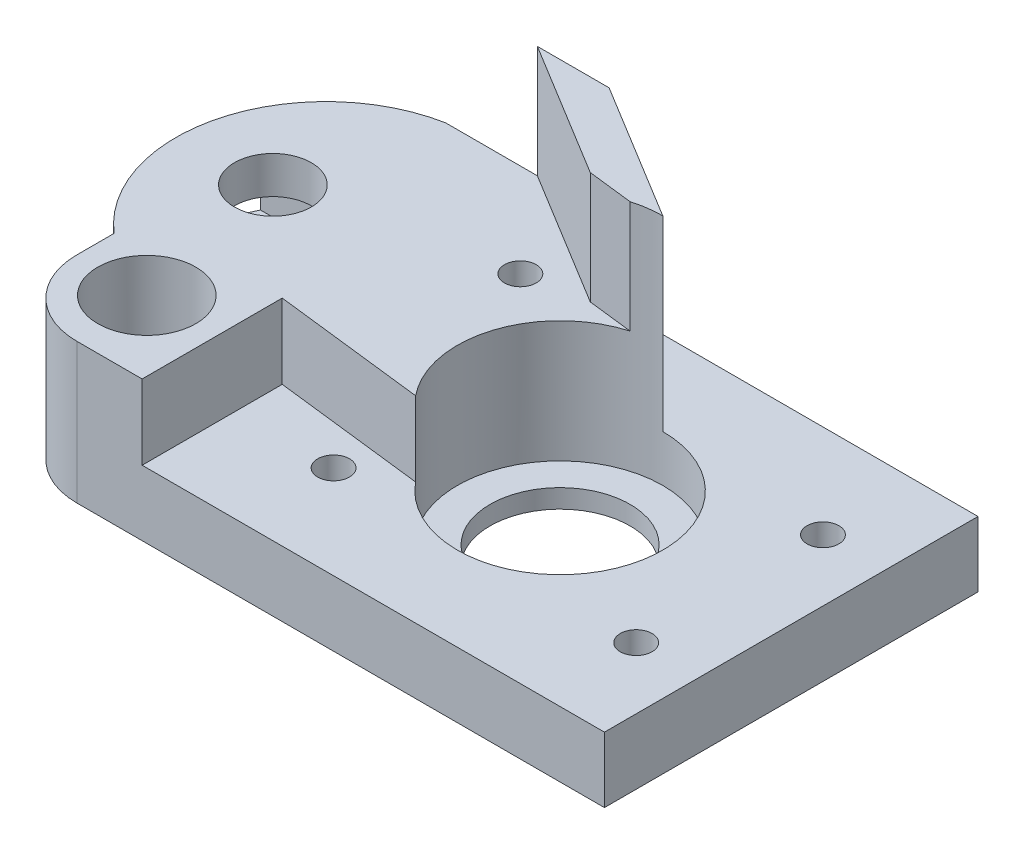
ISO-10303-21;
HEADER;
FILE_DESCRIPTION(('STEP AP214'),'2;1');
FILE_NAME('part.step','',(''),(''),'','','');
FILE_SCHEMA(('AUTOMOTIVE_DESIGN { 1 0 10303 214 1 1 1 1 }'));
ENDSEC;
DATA;
#1=APPLICATION_CONTEXT('core data for automotive mechanical design processes');
#2=APPLICATION_PROTOCOL_DEFINITION('international standard','automotive_design',2000,#1);
#3=PRODUCT_CONTEXT('',#1,'mechanical');
#4=PRODUCT('Part','Part','',(#3));
#5=PRODUCT_RELATED_PRODUCT_CATEGORY('part','',(#4));
#6=PRODUCT_DEFINITION_FORMATION('','',#4);
#7=PRODUCT_DEFINITION_CONTEXT('part definition',#1,'design');
#8=PRODUCT_DEFINITION('design','',#6,#7);
#9=PRODUCT_DEFINITION_SHAPE('','',#8);
#10=(LENGTH_UNIT() NAMED_UNIT(*) SI_UNIT(.MILLI.,.METRE.));
#11=(NAMED_UNIT(*) PLANE_ANGLE_UNIT() SI_UNIT($,.RADIAN.));
#12=(NAMED_UNIT(*) SI_UNIT($,.STERADIAN.) SOLID_ANGLE_UNIT());
#13=UNCERTAINTY_MEASURE_WITH_UNIT(LENGTH_MEASURE(1.E-05),#10,'distance_accuracy_value','');
#14=(GEOMETRIC_REPRESENTATION_CONTEXT(3) GLOBAL_UNCERTAINTY_ASSIGNED_CONTEXT((#13)) GLOBAL_UNIT_ASSIGNED_CONTEXT((#10,
#11,#12)) REPRESENTATION_CONTEXT('',''));
#15=CARTESIAN_POINT('',(0.,0.,0.));
#16=DIRECTION('',(0.,0.,1.));
#17=DIRECTION('',(1.,0.,0.));
#18=AXIS2_PLACEMENT_3D('',#15,#16,#17);
#19=CARTESIAN_POINT('',(-29.2478757622041,13.,-4.19139529344752));
#20=DIRECTION('',(0.,-1.,0.));
#21=DIRECTION('',(0.,0.,-1.));
#22=AXIS2_PLACEMENT_3D('',#19,#20,#21);
#23=CYLINDRICAL_SURFACE('',#22,16.0911383285089);
#24=CARTESIAN_POINT('',(-29.2478757622041,-2.,-4.19139529344752));
#25=DIRECTION('',(0.,-1.,0.));
#26=DIRECTION('',(0.,0.,-1.));
#27=AXIS2_PLACEMENT_3D('',#24,#25,#26);
#28=CIRCLE('',#27,16.0911383285089);
#29=CARTESIAN_POINT('',(-32.250000000002,-2.,-20.));
#30=VERTEX_POINT('',#29);
#31=CARTESIAN_POINT('',(-39.75,-2.,8.));
#32=VERTEX_POINT('',#31);
#33=EDGE_CURVE('E179',#30,#32,#28,.F.);
#34=ORIENTED_EDGE('',*,*,#33,.T.);
#35=DIRECTION('',(0.,-1.,0.));
#36=VECTOR('',#35,1.);
#37=CARTESIAN_POINT('',(-39.75,0.,8.));
#38=LINE('',#37,#36);
#39=CARTESIAN_POINT('',(-39.75,13.,8.));
#40=VERTEX_POINT('',#39);
#41=EDGE_CURVE('E294',#40,#32,#38,.T.);
#42=ORIENTED_EDGE('',*,*,#41,.F.);
#43=CARTESIAN_POINT('',(-29.2478757622041,13.,-4.19139529344752));
#44=DIRECTION('',(0.,-1.,0.));
#45=DIRECTION('',(0.,0.,-1.));
#46=AXIS2_PLACEMENT_3D('',#43,#44,#45);
#47=CIRCLE('',#46,16.0911383285089);
#48=CARTESIAN_POINT('',(-32.250000000002,13.,-20.));
#49=VERTEX_POINT('',#48);
#50=EDGE_CURVE('E203',#49,#40,#47,.F.);
#51=ORIENTED_EDGE('',*,*,#50,.F.);
#52=DIRECTION('',(0.,-1.,0.));
#53=VECTOR('',#52,1.);
#54=CARTESIAN_POINT('',(-32.250000000002,13.,-20.));
#55=LINE('',#54,#53);
#56=EDGE_CURVE('E207',#49,#30,#55,.T.);
#57=ORIENTED_EDGE('',*,*,#56,.T.);
#58=EDGE_LOOP('',(#34,#42,#51,#57));
#59=FACE_BOUND('',#58,.T.);
#60=CARTESIAN_POINT('',(-29.2478757622041,3.49999999999999,-4.19139529344752));
#61=DIRECTION('',(0.,1.,0.));
#62=DIRECTION('',(0.,0.,1.));
#63=AXIS2_PLACEMENT_3D('',#60,#61,#62);
#64=CIRCLE('',#63,16.0911383285089);
#65=CARTESIAN_POINT('',(-43.5834619012696,3.49999999999999,-11.5));
#66=VERTEX_POINT('',#65);
#67=CARTESIAN_POINT('',(-44.2988807891427,3.49999999999999,1.5));
#68=VERTEX_POINT('',#67);
#69=EDGE_CURVE('E165',#66,#68,#64,.T.);
#70=ORIENTED_EDGE('',*,*,#69,.F.);
#71=DIRECTION('',(0.,-1.,0.));
#72=VECTOR('',#71,1.);
#73=CARTESIAN_POINT('',(-43.5834619012696,13.,-11.5));
#74=LINE('',#73,#72);
#75=CARTESIAN_POINT('',(-43.5834619012696,8.99999999999999,-11.5));
#76=VERTEX_POINT('',#75);
#77=EDGE_CURVE('E687',#66,#76,#74,.F.);
#78=ORIENTED_EDGE('',*,*,#77,.T.);
#79=CARTESIAN_POINT('',(-29.2478757622041,8.99999999999999,-4.19139529344752));
#80=DIRECTION('',(0.,1.,0.));
#81=DIRECTION('',(0.,0.,1.));
#82=AXIS2_PLACEMENT_3D('',#79,#80,#81);
#83=CIRCLE('',#82,16.0911383285089);
#84=CARTESIAN_POINT('',(-44.2988807891427,8.99999999999999,1.5));
#85=VERTEX_POINT('',#84);
#86=EDGE_CURVE('E696',#76,#85,#83,.T.);
#87=ORIENTED_EDGE('',*,*,#86,.T.);
#88=DIRECTION('',(0.,-1.,0.));
#89=VECTOR('',#88,1.);
#90=CARTESIAN_POINT('',(-44.2988807891427,13.,1.5));
#91=LINE('',#90,#89);
#92=EDGE_CURVE('E692',#85,#68,#91,.T.);
#93=ORIENTED_EDGE('',*,*,#92,.T.);
#94=EDGE_LOOP('',(#70,#78,#87,#93));
#95=FACE_BOUND('',#94,.T.);
#96=ADVANCED_FACE('F34',(#59,#95),#23,.T.);
#97=CARTESIAN_POINT('',(0.,5.,0.));
#98=DIRECTION('',(0.,1.,0.));
#99=DIRECTION('',(0.,0.,1.));
#100=AXIS2_PLACEMENT_3D('',#97,#98,#99);
#101=PLANE('',#100);
#102=CARTESIAN_POINT('',(-14.25,5.,10.));
#103=DIRECTION('',(0.,1.,0.));
#104=DIRECTION('',(0.,0.,1.));
#105=AXIS2_PLACEMENT_3D('',#102,#103,#104);
#106=CIRCLE('',#105,1.7);
#107=CARTESIAN_POINT('',(-14.25,5.,11.7));
#108=VERTEX_POINT('',#107);
#109=EDGE_CURVE('E345',#108,#108,#106,.T.);
#110=ORIENTED_EDGE('',*,*,#109,.F.);
#111=EDGE_LOOP('',(#110));
#112=FACE_BOUND('',#111,.T.);
#113=CARTESIAN_POINT('',(18.15,5.,-10.));
#114=DIRECTION('',(0.,1.,0.));
#115=DIRECTION('',(0.,0.,1.));
#116=AXIS2_PLACEMENT_3D('',#113,#114,#115);
#117=CIRCLE('',#116,1.7);
#118=CARTESIAN_POINT('',(18.15,5.,-8.3));
#119=VERTEX_POINT('',#118);
#120=EDGE_CURVE('E338',#119,#119,#117,.T.);
#121=ORIENTED_EDGE('',*,*,#120,.F.);
#122=EDGE_LOOP('',(#121));
#123=FACE_BOUND('',#122,.T.);
#124=CARTESIAN_POINT('',(18.15,5.,10.));
#125=DIRECTION('',(0.,1.,0.));
#126=DIRECTION('',(0.,0.,1.));
#127=AXIS2_PLACEMENT_3D('',#124,#125,#126);
#128=CIRCLE('',#127,1.7);
#129=CARTESIAN_POINT('',(18.15,5.,11.7));
#130=VERTEX_POINT('',#129);
#131=EDGE_CURVE('E335',#130,#130,#128,.T.);
#132=ORIENTED_EDGE('',*,*,#131,.F.);
#133=EDGE_LOOP('',(#132));
#134=FACE_BOUND('',#133,.T.);
#135=DIRECTION('',(0.993089905441003,0.,0.117356038239117));
#136=VECTOR('',#135,1.);
#137=CARTESIAN_POINT('',(-0.923593367440806,5.,7.81562895016002));
#138=LINE('',#137,#136);
#139=CARTESIAN_POINT('',(-24.75,5.,5.));
#140=VERTEX_POINT('',#139);
#141=CARTESIAN_POINT('',(-8.55572799075346,5.,6.91371958848765));
#142=VERTEX_POINT('',#141);
#143=EDGE_CURVE('E248',#140,#142,#138,.T.);
#144=ORIENTED_EDGE('',*,*,#143,.F.);
#145=DIRECTION('',(0.,0.,1.));
#146=VECTOR('',#145,1.);
#147=CARTESIAN_POINT('',(-24.75,5.,0.));
#148=LINE('',#147,#146);
#149=CARTESIAN_POINT('',(-24.75,5.,20.));
#150=VERTEX_POINT('',#149);
#151=EDGE_CURVE('E210',#140,#150,#148,.T.);
#152=ORIENTED_EDGE('',*,*,#151,.T.);
#153=DIRECTION('',(-1.,0.,0.));
#154=VECTOR('',#153,1.);
#155=CARTESIAN_POINT('',(0.,5.,20.));
#156=LINE('',#155,#154);
#157=CARTESIAN_POINT('',(24.75,5.,20.));
#158=VERTEX_POINT('',#157);
#159=EDGE_CURVE('E319',#158,#150,#156,.T.);
#160=ORIENTED_EDGE('',*,*,#159,.F.);
#161=DIRECTION('',(0.,0.,-1.));
#162=VECTOR('',#161,1.);
#163=CARTESIAN_POINT('',(24.75,5.,0.));
#164=LINE('',#163,#162);
#165=CARTESIAN_POINT('',(24.75,5.,-20.));
#166=VERTEX_POINT('',#165);
#167=EDGE_CURVE('E351',#158,#166,#164,.T.);
#168=ORIENTED_EDGE('',*,*,#167,.T.);
#169=DIRECTION('',(-1.,0.,0.));
#170=VECTOR('',#169,1.);
#171=CARTESIAN_POINT('',(0.,5.,-20.));
#172=LINE('',#171,#170);
#173=CARTESIAN_POINT('',(-14.75,5.,-20.));
#174=VERTEX_POINT('',#173);
#175=EDGE_CURVE('E343',#166,#174,#172,.T.);
#176=ORIENTED_EDGE('',*,*,#175,.T.);
#177=DIRECTION('',(-0.853639280336631,0.,-0.520864645629131));
#178=VECTOR('',#177,1.);
#179=CARTESIAN_POINT('',(4.89093573372409,5.,-8.01570023027004));
#180=LINE('',#179,#178);
#181=CARTESIAN_POINT('',(0.,5.,-11.));
#182=VERTEX_POINT('',#181);
#183=EDGE_CURVE('E243',#182,#174,#180,.T.);
#184=ORIENTED_EDGE('',*,*,#183,.F.);
#185=CARTESIAN_POINT('',(0.,5.,0.));
#186=DIRECTION('',(0.,1.,0.));
#187=DIRECTION('',(0.,0.,1.));
#188=AXIS2_PLACEMENT_3D('',#185,#186,#187);
#189=CIRCLE('',#188,11.);
#190=EDGE_CURVE('E268',#142,#182,#189,.T.);
#191=ORIENTED_EDGE('',*,*,#190,.F.);
#192=EDGE_LOOP('',(#144,#152,#160,#168,#176,#184,#191));
#193=FACE_BOUND('',#192,.T.);
#194=ADVANCED_FACE('F334',(#112,#123,#134,#193),#101,.T.);
#195=CARTESIAN_POINT('',(0.,25.,0.));
#196=DIRECTION('',(0.,1.,0.));
#197=DIRECTION('',(0.,0.,1.));
#198=AXIS2_PLACEMENT_3D('',#195,#196,#197);
#199=PLANE('',#198);
#200=DIRECTION('',(-0.85363928033663,0.,-0.52086464562913));
#201=VECTOR('',#200,1.);
#202=CARTESIAN_POINT('',(2.80747715120757,25.,-4.60114310892352));
#203=LINE('',#202,#201);
#204=CARTESIAN_POINT('',(-7.89902334630618,25.,-11.1339230735082));
#205=VERTEX_POINT('',#204);
#206=CARTESIAN_POINT('',(-22.4295383091678,25.,-20.));
#207=VERTEX_POINT('',#206);
#208=EDGE_CURVE('E287',#205,#207,#203,.T.);
#209=ORIENTED_EDGE('',*,*,#208,.F.);
#210=DIRECTION('',(-0.993089905441002,0.,-0.117356038239117));
#211=VECTOR('',#210,1.);
#212=CARTESIAN_POINT('',(-48.5103628582198,25.,-15.9330715560269));
#213=LINE('',#212,#211);
#214=CARTESIAN_POINT('',(-3.06913596086125,25.,-10.5631626160799));
#215=VERTEX_POINT('',#214);
#216=EDGE_CURVE('E226',#215,#205,#213,.T.);
#217=ORIENTED_EDGE('',*,*,#216,.F.);
#218=CARTESIAN_POINT('',(0.,25.,0.));
#219=DIRECTION('',(0.,1.,0.));
#220=DIRECTION('',(0.,0.,1.));
#221=AXIS2_PLACEMENT_3D('',#218,#219,#220);
#222=CIRCLE('',#221,11.);
#223=CARTESIAN_POINT('',(0.,25.,-11.));
#224=VERTEX_POINT('',#223);
#225=EDGE_CURVE('E244',#224,#215,#222,.T.);
#226=ORIENTED_EDGE('',*,*,#225,.F.);
#227=DIRECTION('',(-0.853639280336631,0.,-0.520864645629131));
#228=VECTOR('',#227,1.);
#229=CARTESIAN_POINT('',(4.89093573372409,25.,-8.01570023027004));
#230=LINE('',#229,#228);
#231=CARTESIAN_POINT('',(-14.75,25.,-20.));
#232=VERTEX_POINT('',#231);
#233=EDGE_CURVE('E247',#224,#232,#230,.T.);
#234=ORIENTED_EDGE('',*,*,#233,.T.);
#235=DIRECTION('',(-1.,0.,0.));
#236=VECTOR('',#235,1.);
#237=CARTESIAN_POINT('',(0.,25.,-20.));
#238=LINE('',#237,#236);
#239=EDGE_CURVE('E251',#232,#207,#238,.T.);
#240=ORIENTED_EDGE('',*,*,#239,.T.);
#241=EDGE_LOOP('',(#209,#217,#226,#234,#240));
#242=FACE_BOUND('',#241,.T.);
#243=ADVANCED_FACE('F414',(#242),#199,.T.);
#244=CARTESIAN_POINT('',(2.80747715120757,0.,-4.60114310892352));
#245=DIRECTION('',(0.52086464562913,0.,-0.85363928033663));
#246=DIRECTION('',(-0.85363928033663,0.,-0.52086464562913));
#247=AXIS2_PLACEMENT_3D('',#244,#245,#246);
#248=PLANE('',#247);
#249=DIRECTION('',(0.,-1.,0.));
#250=VECTOR('',#249,1.);
#251=CARTESIAN_POINT('',(-7.89902334630618,0.,-11.1339230735082));
#252=LINE('',#251,#250);
#253=CARTESIAN_POINT('',(-7.89902334630618,13.,-11.1339230735082));
#254=VERTEX_POINT('',#253);
#255=EDGE_CURVE('E279',#205,#254,#252,.T.);
#256=ORIENTED_EDGE('',*,*,#255,.F.);
#257=ORIENTED_EDGE('',*,*,#208,.T.);
#258=DIRECTION('',(0.,-1.,0.));
#259=VECTOR('',#258,1.);
#260=CARTESIAN_POINT('',(-22.4295383091678,-2.,-20.));
#261=LINE('',#260,#259);
#262=CARTESIAN_POINT('',(-22.4295383091678,13.,-20.));
#263=VERTEX_POINT('',#262);
#264=EDGE_CURVE('E235',#207,#263,#261,.T.);
#265=ORIENTED_EDGE('',*,*,#264,.T.);
#266=DIRECTION('',(-0.85363928033663,0.,-0.52086464562913));
#267=VECTOR('',#266,1.);
#268=CARTESIAN_POINT('',(-35.0937478883147,13.,-27.7273143194795));
#269=LINE('',#268,#267);
#270=EDGE_CURVE('E233',#254,#263,#269,.T.);
#271=ORIENTED_EDGE('',*,*,#270,.F.);
#272=EDGE_LOOP('',(#256,#257,#265,#271));
#273=FACE_BOUND('',#272,.T.);
#274=ADVANCED_FACE('F433',(#273),#248,.F.);
#275=CARTESIAN_POINT('',(0.,5.,0.));
#276=DIRECTION('',(0.,-1.,0.));
#277=DIRECTION('',(0.,0.,-1.));
#278=AXIS2_PLACEMENT_3D('',#275,#276,#277);
#279=CYLINDRICAL_SURFACE('',#278,11.);
#280=CARTESIAN_POINT('',(0.,13.,0.));
#281=DIRECTION('',(0.,-1.,0.));
#282=DIRECTION('',(1.,0.,0.));
#283=AXIS2_PLACEMENT_3D('',#280,#281,#282);
#284=CIRCLE('',#283,11.);
#285=CARTESIAN_POINT('',(-8.55572799075347,13.,6.91371958848765));
#286=VERTEX_POINT('',#285);
#287=CARTESIAN_POINT('',(-3.06913596086125,13.,-10.5631626160799));
#288=VERTEX_POINT('',#287);
#289=EDGE_CURVE('E288',#286,#288,#284,.T.);
#290=ORIENTED_EDGE('',*,*,#289,.F.);
#291=DIRECTION('',(0.,-1.,0.));
#292=VECTOR('',#291,1.);
#293=CARTESIAN_POINT('',(-8.55572799075346,25.,6.91371958848765));
#294=LINE('',#293,#292);
#295=EDGE_CURVE('E254',#286,#142,#294,.T.);
#296=ORIENTED_EDGE('',*,*,#295,.T.);
#297=ORIENTED_EDGE('',*,*,#190,.T.);
#298=DIRECTION('',(0.,-1.,0.));
#299=VECTOR('',#298,1.);
#300=CARTESIAN_POINT('',(0.,25.,-11.));
#301=LINE('',#300,#299);
#302=EDGE_CURVE('E265',#224,#182,#301,.T.);
#303=ORIENTED_EDGE('',*,*,#302,.F.);
#304=ORIENTED_EDGE('',*,*,#225,.T.);
#305=DIRECTION('',(0.,-1.,0.));
#306=VECTOR('',#305,1.);
#307=CARTESIAN_POINT('',(-3.06913596086124,5.,-10.5631626160799));
#308=LINE('',#307,#306);
#309=EDGE_CURVE('E228',#215,#288,#308,.T.);
#310=ORIENTED_EDGE('',*,*,#309,.T.);
#311=EDGE_LOOP('',(#290,#296,#297,#303,#304,#310));
#312=FACE_BOUND('',#311,.T.);
#313=CARTESIAN_POINT('',(0.,0.,0.));
#314=DIRECTION('',(0.,1.,0.));
#315=DIRECTION('',(0.,0.,1.));
#316=AXIS2_PLACEMENT_3D('',#313,#314,#315);
#317=CIRCLE('',#316,11.);
#318=CARTESIAN_POINT('',(0.,0.,11.));
#319=VERTEX_POINT('',#318);
#320=EDGE_CURVE('E289',#319,#319,#317,.F.);
#321=ORIENTED_EDGE('',*,*,#320,.T.);
#322=EDGE_LOOP('',(#321));
#323=FACE_BOUND('',#322,.T.);
#324=ADVANCED_FACE('F331',(#312,#323),#279,.F.);
#325=CARTESIAN_POINT('',(0.,-2.,-20.));
#326=DIRECTION('',(0.,0.,-1.));
#327=DIRECTION('',(-1.,0.,0.));
#328=AXIS2_PLACEMENT_3D('',#325,#326,#327);
#329=PLANE('',#328);
#330=DIRECTION('',(-1.,0.,0.));
#331=VECTOR('',#330,1.);
#332=CARTESIAN_POINT('',(0.,13.,-20.));
#333=LINE('',#332,#331);
#334=EDGE_CURVE('E241',#263,#49,#333,.T.);
#335=ORIENTED_EDGE('',*,*,#334,.F.);
#336=ORIENTED_EDGE('',*,*,#264,.F.);
#337=ORIENTED_EDGE('',*,*,#239,.F.);
#338=DIRECTION('',(0.,-1.,0.));
#339=VECTOR('',#338,1.);
#340=CARTESIAN_POINT('',(-14.75,25.,-20.));
#341=LINE('',#340,#339);
#342=EDGE_CURVE('E269',#232,#174,#341,.T.);
#343=ORIENTED_EDGE('',*,*,#342,.T.);
#344=ORIENTED_EDGE('',*,*,#175,.F.);
#345=DIRECTION('',(0.,1.,0.));
#346=VECTOR('',#345,1.);
#347=CARTESIAN_POINT('',(24.75,-2.,-20.));
#348=LINE('',#347,#346);
#349=CARTESIAN_POINT('',(24.75,-2.,-20.));
#350=VERTEX_POINT('',#349);
#351=EDGE_CURVE('E379',#350,#166,#348,.T.);
#352=ORIENTED_EDGE('',*,*,#351,.F.);
#353=DIRECTION('',(-1.,0.,0.));
#354=VECTOR('',#353,1.);
#355=CARTESIAN_POINT('',(0.,-2.,-20.));
#356=LINE('',#355,#354);
#357=EDGE_CURVE('E355',#350,#30,#356,.T.);
#358=ORIENTED_EDGE('',*,*,#357,.T.);
#359=ORIENTED_EDGE('',*,*,#56,.F.);
#360=EDGE_LOOP('',(#335,#336,#337,#343,#344,#352,#358,#359));
#361=FACE_BOUND('',#360,.T.);
#362=ADVANCED_FACE('F450',(#361),#329,.T.);
#363=CARTESIAN_POINT('',(24.75,-2.,0.));
#364=DIRECTION('',(1.,0.,0.));
#365=DIRECTION('',(0.,0.,-1.));
#366=AXIS2_PLACEMENT_3D('',#363,#364,#365);
#367=PLANE('',#366);
#368=ORIENTED_EDGE('',*,*,#351,.T.);
#369=ORIENTED_EDGE('',*,*,#167,.F.);
#370=DIRECTION('',(0.,1.,0.));
#371=VECTOR('',#370,1.);
#372=CARTESIAN_POINT('',(24.75,-2.,20.));
#373=LINE('',#372,#371);
#374=CARTESIAN_POINT('',(24.75,-2.,20.));
#375=VERTEX_POINT('',#374);
#376=EDGE_CURVE('E376',#375,#158,#373,.T.);
#377=ORIENTED_EDGE('',*,*,#376,.F.);
#378=DIRECTION('',(0.,0.,-1.));
#379=VECTOR('',#378,1.);
#380=CARTESIAN_POINT('',(24.75,-2.,0.));
#381=LINE('',#380,#379);
#382=EDGE_CURVE('E358',#375,#350,#381,.T.);
#383=ORIENTED_EDGE('',*,*,#382,.T.);
#384=EDGE_LOOP('',(#368,#369,#377,#383));
#385=FACE_BOUND('',#384,.T.);
#386=ADVANCED_FACE('F552',(#385),#367,.T.);
#387=CARTESIAN_POINT('',(0.,-2.,20.));
#388=DIRECTION('',(0.,0.,-1.));
#389=DIRECTION('',(-1.,0.,0.));
#390=AXIS2_PLACEMENT_3D('',#387,#388,#389);
#391=PLANE('',#390);
#392=DIRECTION('',(0.,1.,0.));
#393=VECTOR('',#392,1.);
#394=CARTESIAN_POINT('',(-31.75,-2.,20.));
#395=LINE('',#394,#393);
#396=CARTESIAN_POINT('',(-31.75,13.,20.));
#397=VERTEX_POINT('',#396);
#398=CARTESIAN_POINT('',(-31.75,-2.,20.));
#399=VERTEX_POINT('',#398);
#400=EDGE_CURVE('E11',#397,#399,#395,.F.);
#401=ORIENTED_EDGE('',*,*,#400,.T.);
#402=DIRECTION('',(-1.,0.,0.));
#403=VECTOR('',#402,1.);
#404=CARTESIAN_POINT('',(0.,-2.,20.));
#405=LINE('',#404,#403);
#406=EDGE_CURVE('E307',#375,#399,#405,.T.);
#407=ORIENTED_EDGE('',*,*,#406,.F.);
#408=ORIENTED_EDGE('',*,*,#376,.T.);
#409=ORIENTED_EDGE('',*,*,#159,.T.);
#410=DIRECTION('',(0.,-1.,0.));
#411=VECTOR('',#410,1.);
#412=CARTESIAN_POINT('',(-24.75,13.,20.));
#413=LINE('',#412,#411);
#414=CARTESIAN_POINT('',(-24.75,13.,20.));
#415=VERTEX_POINT('',#414);
#416=EDGE_CURVE('E205',#415,#150,#413,.T.);
#417=ORIENTED_EDGE('',*,*,#416,.F.);
#418=DIRECTION('',(-1.,0.,0.));
#419=VECTOR('',#418,1.);
#420=CARTESIAN_POINT('',(0.,13.,20.));
#421=LINE('',#420,#419);
#422=EDGE_CURVE('E194',#415,#397,#421,.T.);
#423=ORIENTED_EDGE('',*,*,#422,.T.);
#424=EDGE_LOOP('',(#401,#407,#408,#409,#417,#423));
#425=FACE_BOUND('',#424,.T.);
#426=ADVANCED_FACE('F315',(#425),#391,.F.);
#427=CARTESIAN_POINT('',(-14.25,-2.,10.));
#428=DIRECTION('',(0.,1.,0.));
#429=DIRECTION('',(0.,0.,1.));
#430=AXIS2_PLACEMENT_3D('',#427,#428,#429);
#431=CYLINDRICAL_SURFACE('',#430,1.7);
#432=CARTESIAN_POINT('',(-14.25,-2.,10.));
#433=DIRECTION('',(0.,1.,0.));
#434=DIRECTION('',(0.,0.,1.));
#435=AXIS2_PLACEMENT_3D('',#432,#433,#434);
#436=CIRCLE('',#435,1.7);
#437=CARTESIAN_POINT('',(-14.25,-2.,11.7));
#438=VERTEX_POINT('',#437);
#439=EDGE_CURVE('E370',#438,#438,#436,.T.);
#440=ORIENTED_EDGE('',*,*,#439,.F.);
#441=EDGE_LOOP('',(#440));
#442=FACE_BOUND('',#441,.T.);
#443=ORIENTED_EDGE('',*,*,#109,.T.);
#444=EDGE_LOOP('',(#443));
#445=FACE_BOUND('',#444,.T.);
#446=ADVANCED_FACE('F454',(#442,#445),#431,.F.);
#447=CARTESIAN_POINT('',(18.15,-2.,-10.));
#448=DIRECTION('',(0.,1.,0.));
#449=DIRECTION('',(0.,0.,1.));
#450=AXIS2_PLACEMENT_3D('',#447,#448,#449);
#451=CYLINDRICAL_SURFACE('',#450,1.7);
#452=CARTESIAN_POINT('',(18.15,-2.,-10.));
#453=DIRECTION('',(0.,1.,0.));
#454=DIRECTION('',(0.,0.,1.));
#455=AXIS2_PLACEMENT_3D('',#452,#453,#454);
#456=CIRCLE('',#455,1.7);
#457=CARTESIAN_POINT('',(18.15,-2.,-8.3));
#458=VERTEX_POINT('',#457);
#459=EDGE_CURVE('E367',#458,#458,#456,.T.);
#460=ORIENTED_EDGE('',*,*,#459,.F.);
#461=EDGE_LOOP('',(#460));
#462=FACE_BOUND('',#461,.T.);
#463=ORIENTED_EDGE('',*,*,#120,.T.);
#464=EDGE_LOOP('',(#463));
#465=FACE_BOUND('',#464,.T.);
#466=ADVANCED_FACE('F403',(#462,#465),#451,.F.);
#467=CARTESIAN_POINT('',(18.15,-2.,10.));
#468=DIRECTION('',(0.,1.,0.));
#469=DIRECTION('',(0.,0.,1.));
#470=AXIS2_PLACEMENT_3D('',#467,#468,#469);
#471=CYLINDRICAL_SURFACE('',#470,1.7);
#472=CARTESIAN_POINT('',(18.15,-2.,10.));
#473=DIRECTION('',(0.,1.,0.));
#474=DIRECTION('',(0.,0.,1.));
#475=AXIS2_PLACEMENT_3D('',#472,#473,#474);
#476=CIRCLE('',#475,1.7);
#477=CARTESIAN_POINT('',(18.15,-2.,11.7));
#478=VERTEX_POINT('',#477);
#479=EDGE_CURVE('E364',#478,#478,#476,.T.);
#480=ORIENTED_EDGE('',*,*,#479,.F.);
#481=EDGE_LOOP('',(#480));
#482=FACE_BOUND('',#481,.T.);
#483=ORIENTED_EDGE('',*,*,#131,.T.);
#484=EDGE_LOOP('',(#483));
#485=FACE_BOUND('',#484,.T.);
#486=ADVANCED_FACE('F394',(#482,#485),#471,.F.);
#487=CARTESIAN_POINT('',(0.,-2.,0.));
#488=DIRECTION('',(0.,1.,0.));
#489=DIRECTION('',(0.,0.,1.));
#490=AXIS2_PLACEMENT_3D('',#487,#488,#489);
#491=CYLINDRICAL_SURFACE('',#490,7.50000000000001);
#492=CARTESIAN_POINT('',(0.,-2.,0.));
#493=DIRECTION('',(0.,1.,0.));
#494=DIRECTION('',(0.,0.,1.));
#495=AXIS2_PLACEMENT_3D('',#492,#493,#494);
#496=CIRCLE('',#495,7.50000000000001);
#497=CARTESIAN_POINT('',(0.,-2.,7.50000000000001));
#498=VERTEX_POINT('',#497);
#499=EDGE_CURVE('E361',#498,#498,#496,.T.);
#500=ORIENTED_EDGE('',*,*,#499,.F.);
#501=EDGE_LOOP('',(#500));
#502=FACE_BOUND('',#501,.T.);
#503=CARTESIAN_POINT('',(0.,0.,0.));
#504=DIRECTION('',(0.,1.,0.));
#505=DIRECTION('',(0.,0.,1.));
#506=AXIS2_PLACEMENT_3D('',#503,#504,#505);
#507=CIRCLE('',#506,7.50000000000001);
#508=CARTESIAN_POINT('',(0.,0.,7.50000000000001));
#509=VERTEX_POINT('',#508);
#510=EDGE_CURVE('E354',#509,#509,#507,.T.);
#511=ORIENTED_EDGE('',*,*,#510,.T.);
#512=EDGE_LOOP('',(#511));
#513=FACE_BOUND('',#512,.T.);
#514=ADVANCED_FACE('F391',(#502,#513),#491,.F.);
#515=CARTESIAN_POINT('',(-14.25,-2.,-10.));
#516=DIRECTION('',(0.,1.,0.));
#517=DIRECTION('',(0.,0.,1.));
#518=AXIS2_PLACEMENT_3D('',#515,#516,#517);
#519=CYLINDRICAL_SURFACE('',#518,1.7);
#520=CARTESIAN_POINT('',(-14.25,13.,-10.));
#521=DIRECTION('',(0.,-1.,0.));
#522=DIRECTION('',(1.,0.,0.));
#523=AXIS2_PLACEMENT_3D('',#520,#521,#522);
#524=CIRCLE('',#523,1.7);
#525=CARTESIAN_POINT('',(-12.55,13.,-10.));
#526=VERTEX_POINT('',#525);
#527=EDGE_CURVE('E238',#526,#526,#524,.F.);
#528=ORIENTED_EDGE('',*,*,#527,.T.);
#529=EDGE_LOOP('',(#528));
#530=FACE_BOUND('',#529,.T.);
#531=CARTESIAN_POINT('',(-14.25,-2.,-10.));
#532=DIRECTION('',(0.,1.,0.));
#533=DIRECTION('',(0.,0.,1.));
#534=AXIS2_PLACEMENT_3D('',#531,#532,#533);
#535=CIRCLE('',#534,1.7);
#536=CARTESIAN_POINT('',(-14.25,-2.,-8.3));
#537=VERTEX_POINT('',#536);
#538=EDGE_CURVE('E373',#537,#537,#535,.T.);
#539=ORIENTED_EDGE('',*,*,#538,.F.);
#540=EDGE_LOOP('',(#539));
#541=FACE_BOUND('',#540,.T.);
#542=ADVANCED_FACE('F393',(#530,#541),#519,.F.);
#543=CARTESIAN_POINT('',(0.,-2.,0.));
#544=DIRECTION('',(0.,1.,0.));
#545=DIRECTION('',(0.,0.,1.));
#546=AXIS2_PLACEMENT_3D('',#543,#544,#545);
#547=PLANE('',#546);
#548=CARTESIAN_POINT('',(-35.75,-2.,-5.));
#549=DIRECTION('',(0.,1.,0.));
#550=DIRECTION('',(0.,0.,1.));
#551=AXIS2_PLACEMENT_3D('',#548,#549,#550);
#552=CIRCLE('',#551,4.11640556848624);
#553=CARTESIAN_POINT('',(-35.75,-2.,-0.883594431513753));
#554=VERTEX_POINT('',#553);
#555=EDGE_CURVE('E184',#554,#554,#552,.F.);
#556=ORIENTED_EDGE('',*,*,#555,.F.);
#557=EDGE_LOOP('',(#556));
#558=FACE_BOUND('',#557,.T.);
#559=ORIENTED_EDGE('',*,*,#33,.F.);
#560=ORIENTED_EDGE('',*,*,#357,.F.);
#561=ORIENTED_EDGE('',*,*,#382,.F.);
#562=ORIENTED_EDGE('',*,*,#406,.T.);
#563=CARTESIAN_POINT('',(-31.75,-2.,12.));
#564=DIRECTION('',(0.,1.,0.));
#565=DIRECTION('',(0.,0.,1.));
#566=AXIS2_PLACEMENT_3D('',#563,#564,#565);
#567=CIRCLE('',#566,8.);
#568=CARTESIAN_POINT('',(-39.75,-2.,12.));
#569=VERTEX_POINT('',#568);
#570=EDGE_CURVE('E42',#399,#569,#567,.F.);
#571=ORIENTED_EDGE('',*,*,#570,.T.);
#572=DIRECTION('',(0.,0.,1.));
#573=VECTOR('',#572,1.);
#574=CARTESIAN_POINT('',(-39.75,-2.,20.));
#575=LINE('',#574,#573);
#576=EDGE_CURVE('E219',#32,#569,#575,.T.);
#577=ORIENTED_EDGE('',*,*,#576,.F.);
#578=EDGE_LOOP('',(#559,#560,#561,#562,#571,#577));
#579=FACE_BOUND('',#578,.T.);
#580=CARTESIAN_POINT('',(-32.25,-2.,12.));
#581=DIRECTION('',(0.,1.,0.));
#582=DIRECTION('',(0.,0.,1.));
#583=AXIS2_PLACEMENT_3D('',#580,#581,#582);
#584=CIRCLE('',#583,5.25);
#585=CARTESIAN_POINT('',(-32.25,-2.,17.25));
#586=VERTEX_POINT('',#585);
#587=EDGE_CURVE('E216',#586,#586,#584,.T.);
#588=ORIENTED_EDGE('',*,*,#587,.T.);
#589=EDGE_LOOP('',(#588));
#590=FACE_BOUND('',#589,.T.);
#591=ORIENTED_EDGE('',*,*,#538,.T.);
#592=EDGE_LOOP('',(#591));
#593=FACE_BOUND('',#592,.T.);
#594=ORIENTED_EDGE('',*,*,#439,.T.);
#595=EDGE_LOOP('',(#594));
#596=FACE_BOUND('',#595,.T.);
#597=ORIENTED_EDGE('',*,*,#459,.T.);
#598=EDGE_LOOP('',(#597));
#599=FACE_BOUND('',#598,.T.);
#600=ORIENTED_EDGE('',*,*,#479,.T.);
#601=EDGE_LOOP('',(#600));
#602=FACE_BOUND('',#601,.T.);
#603=ORIENTED_EDGE('',*,*,#499,.T.);
#604=EDGE_LOOP('',(#603));
#605=FACE_BOUND('',#604,.T.);
#606=ADVANCED_FACE('F303',(#558,#579,#590,#593,#596,#599,#602,#605),#547,.F.);
#607=CARTESIAN_POINT('',(0.,0.,0.));
#608=DIRECTION('',(0.,1.,0.));
#609=DIRECTION('',(0.,0.,1.));
#610=AXIS2_PLACEMENT_3D('',#607,#608,#609);
#611=PLANE('',#610);
#612=ORIENTED_EDGE('',*,*,#320,.F.);
#613=EDGE_LOOP('',(#612));
#614=FACE_BOUND('',#613,.T.);
#615=ORIENTED_EDGE('',*,*,#510,.F.);
#616=EDGE_LOOP('',(#615));
#617=FACE_BOUND('',#616,.T.);
#618=ADVANCED_FACE('F384',(#614,#617),#611,.T.);
#619=CARTESIAN_POINT('',(4.89093573372409,25.,-8.01570023027004));
#620=DIRECTION('',(-0.520864645629131,0.,0.853639280336631));
#621=DIRECTION('',(0.853639280336631,0.,0.520864645629131));
#622=AXIS2_PLACEMENT_3D('',#619,#620,#621);
#623=PLANE('',#622);
#624=ORIENTED_EDGE('',*,*,#183,.T.);
#625=ORIENTED_EDGE('',*,*,#342,.F.);
#626=ORIENTED_EDGE('',*,*,#233,.F.);
#627=ORIENTED_EDGE('',*,*,#302,.T.);
#628=EDGE_LOOP('',(#624,#625,#626,#627));
#629=FACE_BOUND('',#628,.T.);
#630=ADVANCED_FACE('F387',(#629),#623,.F.);
#631=CARTESIAN_POINT('',(-0.923593367440806,25.,7.81562895016002));
#632=DIRECTION('',(0.117356038239117,0.,-0.993089905441002));
#633=DIRECTION('',(-0.993089905441002,0.,-0.117356038239117));
#634=AXIS2_PLACEMENT_3D('',#631,#632,#633);
#635=PLANE('',#634);
#636=ORIENTED_EDGE('',*,*,#295,.F.);
#637=DIRECTION('',(0.993089905441002,0.,0.117356038239117));
#638=VECTOR('',#637,1.);
#639=CARTESIAN_POINT('',(-50.6227715465239,13.,1.9425467419111));
#640=LINE('',#639,#638);
#641=CARTESIAN_POINT('',(-24.75,13.,5.));
#642=VERTEX_POINT('',#641);
#643=EDGE_CURVE('E222',#642,#286,#640,.T.);
#644=ORIENTED_EDGE('',*,*,#643,.F.);
#645=DIRECTION('',(0.,-1.,0.));
#646=VECTOR('',#645,1.);
#647=CARTESIAN_POINT('',(-24.75,25.,5.));
#648=LINE('',#647,#646);
#649=EDGE_CURVE('E278',#642,#140,#648,.T.);
#650=ORIENTED_EDGE('',*,*,#649,.T.);
#651=ORIENTED_EDGE('',*,*,#143,.T.);
#652=EDGE_LOOP('',(#636,#644,#650,#651));
#653=FACE_BOUND('',#652,.T.);
#654=ADVANCED_FACE('F325',(#653),#635,.F.);
#655=CARTESIAN_POINT('',(-42.3858529271226,13.,-15.7763643947667));
#656=DIRECTION('',(0.,-1.,0.));
#657=DIRECTION('',(1.,0.,0.));
#658=AXIS2_PLACEMENT_3D('',#655,#656,#657);
#659=PLANE('',#658);
#660=CARTESIAN_POINT('',(-35.75,13.,-5.));
#661=DIRECTION('',(0.,1.,0.));
#662=DIRECTION('',(0.,0.,1.));
#663=AXIS2_PLACEMENT_3D('',#660,#661,#662);
#664=CIRCLE('',#663,4.11640556848624);
#665=CARTESIAN_POINT('',(-35.75,13.,-0.883594431513753));
#666=VERTEX_POINT('',#665);
#667=EDGE_CURVE('E700',#666,#666,#664,.T.);
#668=ORIENTED_EDGE('',*,*,#667,.F.);
#669=EDGE_LOOP('',(#668));
#670=FACE_BOUND('',#669,.T.);
#671=ORIENTED_EDGE('',*,*,#289,.T.);
#672=DIRECTION('',(0.993089905441002,0.,0.117356038239117));
#673=VECTOR('',#672,1.);
#674=CARTESIAN_POINT('',(-48.5103628582198,13.,-15.9330715560269));
#675=LINE('',#674,#673);
#676=EDGE_CURVE('E223',#254,#288,#675,.T.);
#677=ORIENTED_EDGE('',*,*,#676,.F.);
#678=ORIENTED_EDGE('',*,*,#270,.T.);
#679=ORIENTED_EDGE('',*,*,#334,.T.);
#680=ORIENTED_EDGE('',*,*,#50,.T.);
#681=DIRECTION('',(0.,0.,-1.));
#682=VECTOR('',#681,1.);
#683=CARTESIAN_POINT('',(-39.75,13.,0.));
#684=LINE('',#683,#682);
#685=CARTESIAN_POINT('',(-39.75,13.,12.));
#686=VERTEX_POINT('',#685);
#687=EDGE_CURVE('E200',#686,#40,#684,.T.);
#688=ORIENTED_EDGE('',*,*,#687,.F.);
#689=CARTESIAN_POINT('',(-31.75,13.,12.));
#690=DIRECTION('',(0.,-1.,0.));
#691=DIRECTION('',(0.,0.,-1.));
#692=AXIS2_PLACEMENT_3D('',#689,#690,#691);
#693=CIRCLE('',#692,8.);
#694=EDGE_CURVE('E197',#397,#686,#693,.T.);
#695=ORIENTED_EDGE('',*,*,#694,.F.);
#696=ORIENTED_EDGE('',*,*,#422,.F.);
#697=DIRECTION('',(0.,0.,-1.));
#698=VECTOR('',#697,1.);
#699=CARTESIAN_POINT('',(-24.75,13.,0.));
#700=LINE('',#699,#698);
#701=EDGE_CURVE('E191',#415,#642,#700,.T.);
#702=ORIENTED_EDGE('',*,*,#701,.T.);
#703=ORIENTED_EDGE('',*,*,#643,.T.);
#704=EDGE_LOOP('',(#671,#677,#678,#679,#680,#688,#695,#696,#702,#703));
#705=FACE_BOUND('',#704,.T.);
#706=ORIENTED_EDGE('',*,*,#527,.F.);
#707=EDGE_LOOP('',(#706));
#708=FACE_BOUND('',#707,.T.);
#709=CARTESIAN_POINT('',(-32.25,13.,12.));
#710=DIRECTION('',(0.,-1.,0.));
#711=DIRECTION('',(0.,0.,-1.));
#712=AXIS2_PLACEMENT_3D('',#709,#710,#711);
#713=CIRCLE('',#712,5.25);
#714=CARTESIAN_POINT('',(-32.25,13.,6.75));
#715=VERTEX_POINT('',#714);
#716=EDGE_CURVE('E182',#715,#715,#713,.F.);
#717=ORIENTED_EDGE('',*,*,#716,.F.);
#718=EDGE_LOOP('',(#717));
#719=FACE_BOUND('',#718,.T.);
#720=ADVANCED_FACE('F312',(#670,#705,#708,#719),#659,.F.);
#721=CARTESIAN_POINT('',(1.1888153208633,0.,-10.059989347778));
#722=DIRECTION('',(-0.117356038239117,0.,0.993089905441003));
#723=DIRECTION('',(0.993089905441002,0.,0.117356038239117));
#724=AXIS2_PLACEMENT_3D('',#721,#722,#723);
#725=PLANE('',#724);
#726=ORIENTED_EDGE('',*,*,#216,.T.);
#727=ORIENTED_EDGE('',*,*,#255,.T.);
#728=ORIENTED_EDGE('',*,*,#676,.T.);
#729=ORIENTED_EDGE('',*,*,#309,.F.);
#730=EDGE_LOOP('',(#726,#727,#728,#729));
#731=FACE_BOUND('',#730,.T.);
#732=ADVANCED_FACE('F430',(#731),#725,.T.);
#733=CARTESIAN_POINT('',(-39.75,0.,0.));
#734=DIRECTION('',(1.,0.,0.));
#735=DIRECTION('',(0.,0.,-1.));
#736=AXIS2_PLACEMENT_3D('',#733,#734,#735);
#737=PLANE('',#736);
#738=DIRECTION('',(0.,1.,0.));
#739=VECTOR('',#738,1.);
#740=CARTESIAN_POINT('',(-39.75,0.,12.));
#741=LINE('',#740,#739);
#742=EDGE_CURVE('E283',#569,#686,#741,.T.);
#743=ORIENTED_EDGE('',*,*,#742,.T.);
#744=ORIENTED_EDGE('',*,*,#687,.T.);
#745=ORIENTED_EDGE('',*,*,#41,.T.);
#746=ORIENTED_EDGE('',*,*,#576,.T.);
#747=EDGE_LOOP('',(#743,#744,#745,#746));
#748=FACE_BOUND('',#747,.T.);
#749=ADVANCED_FACE('F309',(#748),#737,.F.);
#750=CARTESIAN_POINT('',(-32.25,-10.,12.));
#751=DIRECTION('',(0.,1.,0.));
#752=DIRECTION('',(0.,0.,1.));
#753=AXIS2_PLACEMENT_3D('',#750,#751,#752);
#754=CYLINDRICAL_SURFACE('',#753,5.25);
#755=ORIENTED_EDGE('',*,*,#587,.F.);
#756=EDGE_LOOP('',(#755));
#757=FACE_BOUND('',#756,.T.);
#758=ORIENTED_EDGE('',*,*,#716,.T.);
#759=EDGE_LOOP('',(#758));
#760=FACE_BOUND('',#759,.T.);
#761=ADVANCED_FACE('F424',(#757,#760),#754,.F.);
#762=CARTESIAN_POINT('',(-31.75,0.,12.));
#763=DIRECTION('',(0.,1.,0.));
#764=DIRECTION('',(0.,0.,1.));
#765=AXIS2_PLACEMENT_3D('',#762,#763,#764);
#766=CYLINDRICAL_SURFACE('',#765,8.);
#767=ORIENTED_EDGE('',*,*,#570,.F.);
#768=ORIENTED_EDGE('',*,*,#400,.F.);
#769=ORIENTED_EDGE('',*,*,#694,.T.);
#770=ORIENTED_EDGE('',*,*,#742,.F.);
#771=EDGE_LOOP('',(#767,#768,#769,#770));
#772=FACE_BOUND('',#771,.T.);
#773=ADVANCED_FACE('F36',(#772),#766,.T.);
#774=CARTESIAN_POINT('',(-24.75,13.,0.));
#775=DIRECTION('',(-1.,0.,0.));
#776=DIRECTION('',(0.,0.,1.));
#777=AXIS2_PLACEMENT_3D('',#774,#775,#776);
#778=PLANE('',#777);
#779=ORIENTED_EDGE('',*,*,#151,.F.);
#780=ORIENTED_EDGE('',*,*,#649,.F.);
#781=ORIENTED_EDGE('',*,*,#701,.F.);
#782=ORIENTED_EDGE('',*,*,#416,.T.);
#783=EDGE_LOOP('',(#779,#780,#781,#782));
#784=FACE_BOUND('',#783,.T.);
#785=ADVANCED_FACE('F321',(#784),#778,.F.);
#786=CARTESIAN_POINT('',(-35.75,-2.001,-5.));
#787=DIRECTION('',(0.,1.,0.));
#788=DIRECTION('',(0.,0.,1.));
#789=AXIS2_PLACEMENT_3D('',#786,#787,#788);
#790=CYLINDRICAL_SURFACE('',#789,4.11640556848624);
#791=ORIENTED_EDGE('',*,*,#667,.T.);
#792=EDGE_LOOP('',(#791));
#793=FACE_BOUND('',#792,.T.);
#794=CARTESIAN_POINT('',(-35.75,8.99999999999999,-5.));
#795=DIRECTION('',(0.,1.,0.));
#796=DIRECTION('',(0.,0.,1.));
#797=AXIS2_PLACEMENT_3D('',#794,#795,#796);
#798=CIRCLE('',#797,4.11640556848624);
#799=CARTESIAN_POINT('',(-35.75,8.99999999999999,-0.883594431513753));
#800=VERTEX_POINT('',#799);
#801=EDGE_CURVE('E703',#800,#800,#798,.F.);
#802=ORIENTED_EDGE('',*,*,#801,.T.);
#803=EDGE_LOOP('',(#802));
#804=FACE_BOUND('',#803,.T.);
#805=ADVANCED_FACE('F423',(#793,#804),#790,.F.);
#806=CARTESIAN_POINT('',(-35.75,3.49999999999999,-5.));
#807=DIRECTION('',(0.,1.,0.));
#808=DIRECTION('',(0.,0.,1.));
#809=AXIS2_PLACEMENT_3D('',#806,#807,#808);
#810=CIRCLE('',#809,4.11640556848624);
#811=CARTESIAN_POINT('',(-35.75,3.49999999999999,-0.883594431513753));
#812=VERTEX_POINT('',#811);
#813=EDGE_CURVE('E705',#812,#812,#810,.F.);
#814=ORIENTED_EDGE('',*,*,#813,.F.);
#815=EDGE_LOOP('',(#814));
#816=FACE_BOUND('',#815,.T.);
#817=ORIENTED_EDGE('',*,*,#555,.T.);
#818=EDGE_LOOP('',(#817));
#819=FACE_BOUND('',#818,.T.);
#820=ADVANCED_FACE('F621',(#816,#819),#790,.F.);
#821=CARTESIAN_POINT('',(-35.75,3.49999999999999,-5.));
#822=DIRECTION('',(0.,1.,0.));
#823=DIRECTION('',(0.,0.,1.));
#824=AXIS2_PLACEMENT_3D('',#821,#822,#823);
#825=CYLINDRICAL_SURFACE('',#824,6.5);
#826=CARTESIAN_POINT('',(-35.75,8.99999999999999,-5.));
#827=DIRECTION('',(0.,1.,0.));
#828=DIRECTION('',(0.,0.,1.));
#829=AXIS2_PLACEMENT_3D('',#826,#827,#828);
#830=CIRCLE('',#829,6.5);
#831=CARTESIAN_POINT('',(-35.75,8.99999999999999,1.5));
#832=VERTEX_POINT('',#831);
#833=CARTESIAN_POINT('',(-35.75,8.99999999999999,-11.5));
#834=VERTEX_POINT('',#833);
#835=EDGE_CURVE('E180',#832,#834,#830,.T.);
#836=ORIENTED_EDGE('',*,*,#835,.T.);
#837=DIRECTION('',(0.,1.,0.));
#838=VECTOR('',#837,1.);
#839=CARTESIAN_POINT('',(-35.75,3.49999999999999,-11.5));
#840=LINE('',#839,#838);
#841=CARTESIAN_POINT('',(-35.75,3.49999999999999,-11.5));
#842=VERTEX_POINT('',#841);
#843=EDGE_CURVE('E175',#842,#834,#840,.T.);
#844=ORIENTED_EDGE('',*,*,#843,.F.);
#845=CARTESIAN_POINT('',(-35.75,3.49999999999999,-5.));
#846=DIRECTION('',(0.,1.,0.));
#847=DIRECTION('',(0.,0.,1.));
#848=AXIS2_PLACEMENT_3D('',#845,#846,#847);
#849=CIRCLE('',#848,6.5);
#850=CARTESIAN_POINT('',(-35.75,3.49999999999999,1.5));
#851=VERTEX_POINT('',#850);
#852=EDGE_CURVE('E163',#851,#842,#849,.T.);
#853=ORIENTED_EDGE('',*,*,#852,.F.);
#854=DIRECTION('',(0.,1.,0.));
#855=VECTOR('',#854,1.);
#856=CARTESIAN_POINT('',(-35.75,3.49999999999999,1.5));
#857=LINE('',#856,#855);
#858=EDGE_CURVE('E171',#851,#832,#857,.T.);
#859=ORIENTED_EDGE('',*,*,#858,.T.);
#860=EDGE_LOOP('',(#836,#844,#853,#859));
#861=FACE_BOUND('',#860,.T.);
#862=ADVANCED_FACE('F178',(#861),#825,.F.);
#863=CARTESIAN_POINT('',(0.,3.49999999999999,0.));
#864=DIRECTION('',(0.,1.,0.));
#865=DIRECTION('',(0.,0.,1.));
#866=AXIS2_PLACEMENT_3D('',#863,#864,#865);
#867=PLANE('',#866);
#868=ORIENTED_EDGE('',*,*,#813,.T.);
#869=EDGE_LOOP('',(#868));
#870=FACE_BOUND('',#869,.T.);
#871=ORIENTED_EDGE('',*,*,#852,.T.);
#872=DIRECTION('',(-1.,0.,0.));
#873=VECTOR('',#872,1.);
#874=CARTESIAN_POINT('',(0.,3.49999999999999,-11.5));
#875=LINE('',#874,#873);
#876=EDGE_CURVE('E168',#842,#66,#875,.T.);
#877=ORIENTED_EDGE('',*,*,#876,.T.);
#878=ORIENTED_EDGE('',*,*,#69,.T.);
#879=DIRECTION('',(1.,0.,0.));
#880=VECTOR('',#879,1.);
#881=CARTESIAN_POINT('',(0.,3.49999999999999,1.5));
#882=LINE('',#881,#880);
#883=EDGE_CURVE('E158',#68,#851,#882,.T.);
#884=ORIENTED_EDGE('',*,*,#883,.T.);
#885=EDGE_LOOP('',(#871,#877,#878,#884));
#886=FACE_BOUND('',#885,.T.);
#887=ADVANCED_FACE('F160',(#870,#886),#867,.T.);
#888=CARTESIAN_POINT('',(0.,8.99999999999999,0.));
#889=DIRECTION('',(0.,1.,0.));
#890=DIRECTION('',(0.,0.,1.));
#891=AXIS2_PLACEMENT_3D('',#888,#889,#890);
#892=PLANE('',#891);
#893=ORIENTED_EDGE('',*,*,#801,.F.);
#894=EDGE_LOOP('',(#893));
#895=FACE_BOUND('',#894,.T.);
#896=ORIENTED_EDGE('',*,*,#835,.F.);
#897=DIRECTION('',(1.,0.,0.));
#898=VECTOR('',#897,1.);
#899=CARTESIAN_POINT('',(0.,8.99999999999999,1.5));
#900=LINE('',#899,#898);
#901=EDGE_CURVE('E49',#85,#832,#900,.T.);
#902=ORIENTED_EDGE('',*,*,#901,.F.);
#903=ORIENTED_EDGE('',*,*,#86,.F.);
#904=DIRECTION('',(-1.,0.,0.));
#905=VECTOR('',#904,1.);
#906=CARTESIAN_POINT('',(0.,8.99999999999999,-11.5));
#907=LINE('',#906,#905);
#908=EDGE_CURVE('E54',#834,#76,#907,.T.);
#909=ORIENTED_EDGE('',*,*,#908,.F.);
#910=EDGE_LOOP('',(#896,#902,#903,#909));
#911=FACE_BOUND('',#910,.T.);
#912=ADVANCED_FACE('F652',(#895,#911),#892,.F.);
#913=CARTESIAN_POINT('',(0.,3.49999999999999,-11.5));
#914=DIRECTION('',(0.,0.,-1.));
#915=DIRECTION('',(-1.,0.,0.));
#916=AXIS2_PLACEMENT_3D('',#913,#914,#915);
#917=PLANE('',#916);
#918=ORIENTED_EDGE('',*,*,#876,.F.);
#919=ORIENTED_EDGE('',*,*,#843,.T.);
#920=ORIENTED_EDGE('',*,*,#908,.T.);
#921=ORIENTED_EDGE('',*,*,#77,.F.);
#922=EDGE_LOOP('',(#918,#919,#920,#921));
#923=FACE_BOUND('',#922,.T.);
#924=ADVANCED_FACE('F664',(#923),#917,.F.);
#925=CARTESIAN_POINT('',(0.,3.49999999999999,1.5));
#926=DIRECTION('',(0.,0.,1.));
#927=DIRECTION('',(1.,0.,0.));
#928=AXIS2_PLACEMENT_3D('',#925,#926,#927);
#929=PLANE('',#928);
#930=ORIENTED_EDGE('',*,*,#901,.T.);
#931=ORIENTED_EDGE('',*,*,#858,.F.);
#932=ORIENTED_EDGE('',*,*,#883,.F.);
#933=ORIENTED_EDGE('',*,*,#92,.F.);
#934=EDGE_LOOP('',(#930,#931,#932,#933));
#935=FACE_BOUND('',#934,.T.);
#936=ADVANCED_FACE('F172',(#935),#929,.F.);
#937=CLOSED_SHELL('',(#96,#194,#243,#274,#324,#362,#386,#426,#446,#466,#486,#514,#542,#606,#618,
#630,#654,#720,#732,#749,#761,#773,#785,#805,#820,#862,#887,#912,#924,#936));
#938=MANIFOLD_SOLID_BREP('B2',#937);
#939=ADVANCED_BREP_SHAPE_REPRESENTATION('',(#18,#938),#14);
#940=SHAPE_DEFINITION_REPRESENTATION(#9,#939);
ENDSEC;
END-ISO-10303-21;
